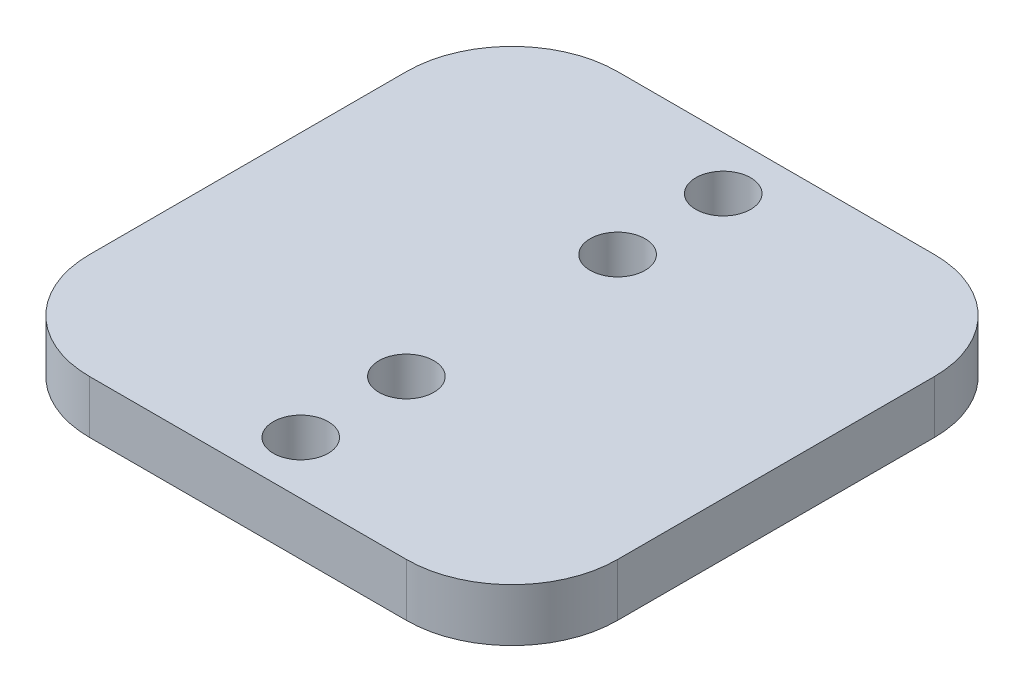
ISO-10303-21;
HEADER;
FILE_DESCRIPTION(('STEP AP214'),'2;1');
FILE_NAME('part.step','',(''),(''),'','','');
FILE_SCHEMA(('AUTOMOTIVE_DESIGN { 1 0 10303 214 1 1 1 1 }'));
ENDSEC;
DATA;
#1=APPLICATION_CONTEXT('core data for automotive mechanical design processes');
#2=APPLICATION_PROTOCOL_DEFINITION('international standard','automotive_design',2000,#1);
#3=PRODUCT_CONTEXT('',#1,'mechanical');
#4=PRODUCT('Part','Part','',(#3));
#5=PRODUCT_RELATED_PRODUCT_CATEGORY('part','',(#4));
#6=PRODUCT_DEFINITION_FORMATION('','',#4);
#7=PRODUCT_DEFINITION_CONTEXT('part definition',#1,'design');
#8=PRODUCT_DEFINITION('design','',#6,#7);
#9=PRODUCT_DEFINITION_SHAPE('','',#8);
#10=(LENGTH_UNIT() NAMED_UNIT(*) SI_UNIT(.MILLI.,.METRE.));
#11=(NAMED_UNIT(*) PLANE_ANGLE_UNIT() SI_UNIT($,.RADIAN.));
#12=(NAMED_UNIT(*) SI_UNIT($,.STERADIAN.) SOLID_ANGLE_UNIT());
#13=UNCERTAINTY_MEASURE_WITH_UNIT(LENGTH_MEASURE(1.E-05),#10,'distance_accuracy_value','');
#14=(GEOMETRIC_REPRESENTATION_CONTEXT(3) GLOBAL_UNCERTAINTY_ASSIGNED_CONTEXT((#13)) GLOBAL_UNIT_ASSIGNED_CONTEXT((#10,
#11,#12)) REPRESENTATION_CONTEXT('',''));
#15=CARTESIAN_POINT('',(0.,0.,0.));
#16=DIRECTION('',(0.,0.,1.));
#17=DIRECTION('',(1.,0.,0.));
#18=AXIS2_PLACEMENT_3D('',#15,#16,#17);
#19=CARTESIAN_POINT('',(0.,5.,0.));
#20=DIRECTION('',(1.,0.,0.));
#21=DIRECTION('',(0.,0.,-1.));
#22=AXIS2_PLACEMENT_3D('',#19,#20,#21);
#23=PLANE('',#22);
#24=DIRECTION('',(0.,0.,1.));
#25=VECTOR('',#24,1.);
#26=CARTESIAN_POINT('',(0.,0.,0.));
#27=LINE('',#26,#25);
#28=CARTESIAN_POINT('',(0.,0.,-40.));
#29=VERTEX_POINT('',#28);
#30=CARTESIAN_POINT('',(0.,0.,-10.));
#31=VERTEX_POINT('',#30);
#32=EDGE_CURVE('E148',#29,#31,#27,.T.);
#33=ORIENTED_EDGE('',*,*,#32,.T.);
#34=DIRECTION('',(0.,-1.,0.));
#35=VECTOR('',#34,1.);
#36=CARTESIAN_POINT('',(0.,5.,-10.));
#37=LINE('',#36,#35);
#38=CARTESIAN_POINT('',(0.,5.,-10.));
#39=VERTEX_POINT('',#38);
#40=EDGE_CURVE('E182',#31,#39,#37,.F.);
#41=ORIENTED_EDGE('',*,*,#40,.T.);
#42=DIRECTION('',(0.,0.,1.));
#43=VECTOR('',#42,1.);
#44=CARTESIAN_POINT('',(0.,5.,0.));
#45=LINE('',#44,#43);
#46=CARTESIAN_POINT('',(0.,5.,-40.));
#47=VERTEX_POINT('',#46);
#48=EDGE_CURVE('E146',#47,#39,#45,.T.);
#49=ORIENTED_EDGE('',*,*,#48,.F.);
#50=DIRECTION('',(0.,-1.,0.));
#51=VECTOR('',#50,1.);
#52=CARTESIAN_POINT('',(0.,5.,-40.));
#53=LINE('',#52,#51);
#54=EDGE_CURVE('E178',#47,#29,#53,.T.);
#55=ORIENTED_EDGE('',*,*,#54,.T.);
#56=EDGE_LOOP('',(#33,#41,#49,#55));
#57=FACE_BOUND('',#56,.T.);
#58=ADVANCED_FACE('F47',(#57),#23,.F.);
#59=CARTESIAN_POINT('',(0.,5.,0.));
#60=DIRECTION('',(0.,0.,-1.));
#61=DIRECTION('',(-1.,0.,0.));
#62=AXIS2_PLACEMENT_3D('',#59,#60,#61);
#63=PLANE('',#62);
#64=DIRECTION('',(1.,0.,0.));
#65=VECTOR('',#64,1.);
#66=CARTESIAN_POINT('',(0.,0.,0.));
#67=LINE('',#66,#65);
#68=CARTESIAN_POINT('',(10.,0.,0.));
#69=VERTEX_POINT('',#68);
#70=CARTESIAN_POINT('',(40.,0.,0.));
#71=VERTEX_POINT('',#70);
#72=EDGE_CURVE('E142',#69,#71,#67,.T.);
#73=ORIENTED_EDGE('',*,*,#72,.T.);
#74=DIRECTION('',(0.,-1.,0.));
#75=VECTOR('',#74,1.);
#76=CARTESIAN_POINT('',(40.,5.,0.));
#77=LINE('',#76,#75);
#78=CARTESIAN_POINT('',(40.,5.,0.));
#79=VERTEX_POINT('',#78);
#80=EDGE_CURVE('E118',#71,#79,#77,.F.);
#81=ORIENTED_EDGE('',*,*,#80,.T.);
#82=DIRECTION('',(1.,0.,0.));
#83=VECTOR('',#82,1.);
#84=CARTESIAN_POINT('',(0.,5.,0.));
#85=LINE('',#84,#83);
#86=CARTESIAN_POINT('',(10.,5.,0.));
#87=VERTEX_POINT('',#86);
#88=EDGE_CURVE('E201',#87,#79,#85,.T.);
#89=ORIENTED_EDGE('',*,*,#88,.F.);
#90=DIRECTION('',(0.,-1.,0.));
#91=VECTOR('',#90,1.);
#92=CARTESIAN_POINT('',(10.,5.,0.));
#93=LINE('',#92,#91);
#94=EDGE_CURVE('E124',#87,#69,#93,.T.);
#95=ORIENTED_EDGE('',*,*,#94,.T.);
#96=EDGE_LOOP('',(#73,#81,#89,#95));
#97=FACE_BOUND('',#96,.T.);
#98=ADVANCED_FACE('F258',(#97),#63,.F.);
#99=CARTESIAN_POINT('',(50.,5.,0.));
#100=DIRECTION('',(-1.,0.,0.));
#101=DIRECTION('',(0.,0.,1.));
#102=AXIS2_PLACEMENT_3D('',#99,#100,#101);
#103=PLANE('',#102);
#104=DIRECTION('',(0.,0.,-1.));
#105=VECTOR('',#104,1.);
#106=CARTESIAN_POINT('',(50.,5.,0.));
#107=LINE('',#106,#105);
#108=CARTESIAN_POINT('',(50.,5.,-10.));
#109=VERTEX_POINT('',#108);
#110=CARTESIAN_POINT('',(50.,5.,-40.));
#111=VERTEX_POINT('',#110);
#112=EDGE_CURVE('E133',#109,#111,#107,.T.);
#113=ORIENTED_EDGE('',*,*,#112,.F.);
#114=DIRECTION('',(0.,-1.,0.));
#115=VECTOR('',#114,1.);
#116=CARTESIAN_POINT('',(50.,5.,-10.));
#117=LINE('',#116,#115);
#118=CARTESIAN_POINT('',(50.,0.,-10.));
#119=VERTEX_POINT('',#118);
#120=EDGE_CURVE('E117',#109,#119,#117,.T.);
#121=ORIENTED_EDGE('',*,*,#120,.T.);
#122=DIRECTION('',(0.,0.,-1.));
#123=VECTOR('',#122,1.);
#124=CARTESIAN_POINT('',(50.,0.,0.));
#125=LINE('',#124,#123);
#126=CARTESIAN_POINT('',(50.,0.,-40.));
#127=VERTEX_POINT('',#126);
#128=EDGE_CURVE('E131',#119,#127,#125,.T.);
#129=ORIENTED_EDGE('',*,*,#128,.T.);
#130=DIRECTION('',(0.,-1.,0.));
#131=VECTOR('',#130,1.);
#132=CARTESIAN_POINT('',(50.,5.,-40.));
#133=LINE('',#132,#131);
#134=EDGE_CURVE('E136',#127,#111,#133,.F.);
#135=ORIENTED_EDGE('',*,*,#134,.T.);
#136=EDGE_LOOP('',(#113,#121,#129,#135));
#137=FACE_BOUND('',#136,.T.);
#138=ADVANCED_FACE('F130',(#137),#103,.F.);
#139=CARTESIAN_POINT('',(0.,5.,-50.));
#140=DIRECTION('',(0.,0.,1.));
#141=DIRECTION('',(1.,0.,0.));
#142=AXIS2_PLACEMENT_3D('',#139,#140,#141);
#143=PLANE('',#142);
#144=DIRECTION('',(-1.,0.,0.));
#145=VECTOR('',#144,1.);
#146=CARTESIAN_POINT('',(0.,0.,-50.));
#147=LINE('',#146,#145);
#148=CARTESIAN_POINT('',(40.,0.,-50.));
#149=VERTEX_POINT('',#148);
#150=CARTESIAN_POINT('',(10.,0.,-50.));
#151=VERTEX_POINT('',#150);
#152=EDGE_CURVE('E141',#149,#151,#147,.T.);
#153=ORIENTED_EDGE('',*,*,#152,.T.);
#154=DIRECTION('',(0.,-1.,0.));
#155=VECTOR('',#154,1.);
#156=CARTESIAN_POINT('',(10.,5.,-50.));
#157=LINE('',#156,#155);
#158=CARTESIAN_POINT('',(10.,5.,-50.));
#159=VERTEX_POINT('',#158);
#160=EDGE_CURVE('E11',#151,#159,#157,.F.);
#161=ORIENTED_EDGE('',*,*,#160,.T.);
#162=DIRECTION('',(-1.,0.,0.));
#163=VECTOR('',#162,1.);
#164=CARTESIAN_POINT('',(0.,5.,-50.));
#165=LINE('',#164,#163);
#166=CARTESIAN_POINT('',(40.,5.,-50.));
#167=VERTEX_POINT('',#166);
#168=EDGE_CURVE('E153',#167,#159,#165,.T.);
#169=ORIENTED_EDGE('',*,*,#168,.F.);
#170=DIRECTION('',(0.,-1.,0.));
#171=VECTOR('',#170,1.);
#172=CARTESIAN_POINT('',(40.,5.,-50.));
#173=LINE('',#172,#171);
#174=EDGE_CURVE('E56',#167,#149,#173,.T.);
#175=ORIENTED_EDGE('',*,*,#174,.T.);
#176=EDGE_LOOP('',(#153,#161,#169,#175));
#177=FACE_BOUND('',#176,.T.);
#178=ADVANCED_FACE('F187',(#177),#143,.F.);
#179=CARTESIAN_POINT('',(0.,5.,0.));
#180=DIRECTION('',(0.,-1.,0.));
#181=DIRECTION('',(0.,0.,-1.));
#182=AXIS2_PLACEMENT_3D('',#179,#180,#181);
#183=PLANE('',#182);
#184=CARTESIAN_POINT('',(25.,5.,-5.));
#185=DIRECTION('',(0.,1.,0.));
#186=DIRECTION('',(0.,0.,-1.));
#187=AXIS2_PLACEMENT_3D('',#184,#185,#186);
#188=CIRCLE('',#187,2.6);
#189=CARTESIAN_POINT('',(25.,5.,-7.6));
#190=VERTEX_POINT('',#189);
#191=EDGE_CURVE('E227',#190,#190,#188,.T.);
#192=ORIENTED_EDGE('',*,*,#191,.F.);
#193=EDGE_LOOP('',(#192));
#194=FACE_BOUND('',#193,.T.);
#195=CARTESIAN_POINT('',(25.,5.,-15.));
#196=DIRECTION('',(0.,1.,0.));
#197=DIRECTION('',(0.,0.,-1.));
#198=AXIS2_PLACEMENT_3D('',#195,#196,#197);
#199=CIRCLE('',#198,2.6);
#200=CARTESIAN_POINT('',(25.,5.,-17.6));
#201=VERTEX_POINT('',#200);
#202=EDGE_CURVE('E235',#201,#201,#199,.T.);
#203=ORIENTED_EDGE('',*,*,#202,.F.);
#204=EDGE_LOOP('',(#203));
#205=FACE_BOUND('',#204,.T.);
#206=CARTESIAN_POINT('',(25.,5.,-45.));
#207=DIRECTION('',(0.,1.,0.));
#208=DIRECTION('',(0.,0.,1.));
#209=AXIS2_PLACEMENT_3D('',#206,#207,#208);
#210=CIRCLE('',#209,2.6);
#211=CARTESIAN_POINT('',(25.,5.,-42.4));
#212=VERTEX_POINT('',#211);
#213=EDGE_CURVE('E221',#212,#212,#210,.T.);
#214=ORIENTED_EDGE('',*,*,#213,.F.);
#215=EDGE_LOOP('',(#214));
#216=FACE_BOUND('',#215,.T.);
#217=CARTESIAN_POINT('',(25.,5.,-35.));
#218=DIRECTION('',(0.,1.,0.));
#219=DIRECTION('',(0.,0.,1.));
#220=AXIS2_PLACEMENT_3D('',#217,#218,#219);
#221=CIRCLE('',#220,2.6);
#222=CARTESIAN_POINT('',(25.,5.,-32.4));
#223=VERTEX_POINT('',#222);
#224=EDGE_CURVE('E207',#223,#223,#221,.T.);
#225=ORIENTED_EDGE('',*,*,#224,.F.);
#226=EDGE_LOOP('',(#225));
#227=FACE_BOUND('',#226,.T.);
#228=ORIENTED_EDGE('',*,*,#88,.T.);
#229=CARTESIAN_POINT('',(40.,5.,-10.));
#230=DIRECTION('',(0.,-1.,0.));
#231=DIRECTION('',(0.,0.,-1.));
#232=AXIS2_PLACEMENT_3D('',#229,#230,#231);
#233=CIRCLE('',#232,10.);
#234=EDGE_CURVE('E175',#79,#109,#233,.F.);
#235=ORIENTED_EDGE('',*,*,#234,.T.);
#236=ORIENTED_EDGE('',*,*,#112,.T.);
#237=CARTESIAN_POINT('',(40.,5.,-40.));
#238=DIRECTION('',(0.,-1.,0.));
#239=DIRECTION('',(0.,0.,-1.));
#240=AXIS2_PLACEMENT_3D('',#237,#238,#239);
#241=CIRCLE('',#240,10.);
#242=EDGE_CURVE('E68',#111,#167,#241,.F.);
#243=ORIENTED_EDGE('',*,*,#242,.T.);
#244=ORIENTED_EDGE('',*,*,#168,.T.);
#245=CARTESIAN_POINT('',(10.,5.,-40.));
#246=DIRECTION('',(0.,-1.,0.));
#247=DIRECTION('',(0.,0.,-1.));
#248=AXIS2_PLACEMENT_3D('',#245,#246,#247);
#249=CIRCLE('',#248,10.);
#250=EDGE_CURVE('E169',#159,#47,#249,.F.);
#251=ORIENTED_EDGE('',*,*,#250,.T.);
#252=ORIENTED_EDGE('',*,*,#48,.T.);
#253=CARTESIAN_POINT('',(10.,5.,-10.));
#254=DIRECTION('',(0.,-1.,0.));
#255=DIRECTION('',(0.,0.,-1.));
#256=AXIS2_PLACEMENT_3D('',#253,#254,#255);
#257=CIRCLE('',#256,10.);
#258=EDGE_CURVE('E172',#39,#87,#257,.F.);
#259=ORIENTED_EDGE('',*,*,#258,.T.);
#260=EDGE_LOOP('',(#228,#235,#236,#243,#244,#251,#252,#259));
#261=FACE_BOUND('',#260,.T.);
#262=ADVANCED_FACE('F249',(#194,#205,#216,#227,#261),#183,.F.);
#263=CARTESIAN_POINT('',(0.,0.,0.));
#264=DIRECTION('',(0.,-1.,0.));
#265=DIRECTION('',(0.,0.,-1.));
#266=AXIS2_PLACEMENT_3D('',#263,#264,#265);
#267=PLANE('',#266);
#268=CARTESIAN_POINT('',(25.,0.,-5.));
#269=DIRECTION('',(0.,1.,0.));
#270=DIRECTION('',(0.,0.,-1.));
#271=AXIS2_PLACEMENT_3D('',#268,#269,#270);
#272=CIRCLE('',#271,2.6);
#273=CARTESIAN_POINT('',(25.,0.,-7.6));
#274=VERTEX_POINT('',#273);
#275=EDGE_CURVE('E223',#274,#274,#272,.T.);
#276=ORIENTED_EDGE('',*,*,#275,.T.);
#277=EDGE_LOOP('',(#276));
#278=FACE_BOUND('',#277,.T.);
#279=CARTESIAN_POINT('',(25.,0.,-15.));
#280=DIRECTION('',(0.,1.,0.));
#281=DIRECTION('',(0.,0.,-1.));
#282=AXIS2_PLACEMENT_3D('',#279,#280,#281);
#283=CIRCLE('',#282,2.6);
#284=CARTESIAN_POINT('',(25.,0.,-17.6));
#285=VERTEX_POINT('',#284);
#286=EDGE_CURVE('E231',#285,#285,#283,.T.);
#287=ORIENTED_EDGE('',*,*,#286,.T.);
#288=EDGE_LOOP('',(#287));
#289=FACE_BOUND('',#288,.T.);
#290=CARTESIAN_POINT('',(25.,0.,-45.));
#291=DIRECTION('',(0.,1.,0.));
#292=DIRECTION('',(0.,0.,1.));
#293=AXIS2_PLACEMENT_3D('',#290,#291,#292);
#294=CIRCLE('',#293,2.6);
#295=CARTESIAN_POINT('',(25.,0.,-42.4));
#296=VERTEX_POINT('',#295);
#297=EDGE_CURVE('E239',#296,#296,#294,.T.);
#298=ORIENTED_EDGE('',*,*,#297,.T.);
#299=EDGE_LOOP('',(#298));
#300=FACE_BOUND('',#299,.T.);
#301=CARTESIAN_POINT('',(25.,0.,-35.));
#302=DIRECTION('',(0.,1.,0.));
#303=DIRECTION('',(0.,0.,1.));
#304=AXIS2_PLACEMENT_3D('',#301,#302,#303);
#305=CIRCLE('',#304,2.6);
#306=CARTESIAN_POINT('',(25.,0.,-32.4));
#307=VERTEX_POINT('',#306);
#308=EDGE_CURVE('E214',#307,#307,#305,.T.);
#309=ORIENTED_EDGE('',*,*,#308,.T.);
#310=EDGE_LOOP('',(#309));
#311=FACE_BOUND('',#310,.T.);
#312=ORIENTED_EDGE('',*,*,#128,.F.);
#313=CARTESIAN_POINT('',(40.,0.,-10.));
#314=DIRECTION('',(0.,-1.,0.));
#315=DIRECTION('',(0.,0.,-1.));
#316=AXIS2_PLACEMENT_3D('',#313,#314,#315);
#317=CIRCLE('',#316,10.);
#318=EDGE_CURVE('E113',#119,#71,#317,.T.);
#319=ORIENTED_EDGE('',*,*,#318,.T.);
#320=ORIENTED_EDGE('',*,*,#72,.F.);
#321=CARTESIAN_POINT('',(10.,0.,-10.));
#322=DIRECTION('',(0.,-1.,0.));
#323=DIRECTION('',(0.,0.,-1.));
#324=AXIS2_PLACEMENT_3D('',#321,#322,#323);
#325=CIRCLE('',#324,10.);
#326=EDGE_CURVE('E125',#69,#31,#325,.T.);
#327=ORIENTED_EDGE('',*,*,#326,.T.);
#328=ORIENTED_EDGE('',*,*,#32,.F.);
#329=CARTESIAN_POINT('',(10.,0.,-40.));
#330=DIRECTION('',(0.,-1.,0.));
#331=DIRECTION('',(0.,0.,-1.));
#332=AXIS2_PLACEMENT_3D('',#329,#330,#331);
#333=CIRCLE('',#332,10.);
#334=EDGE_CURVE('E157',#29,#151,#333,.T.);
#335=ORIENTED_EDGE('',*,*,#334,.T.);
#336=ORIENTED_EDGE('',*,*,#152,.F.);
#337=CARTESIAN_POINT('',(40.,0.,-40.));
#338=DIRECTION('',(0.,-1.,0.));
#339=DIRECTION('',(0.,0.,-1.));
#340=AXIS2_PLACEMENT_3D('',#337,#338,#339);
#341=CIRCLE('',#340,10.);
#342=EDGE_CURVE('E135',#149,#127,#341,.T.);
#343=ORIENTED_EDGE('',*,*,#342,.T.);
#344=EDGE_LOOP('',(#312,#319,#320,#327,#328,#335,#336,#343));
#345=FACE_BOUND('',#344,.T.);
#346=ADVANCED_FACE('F138',(#278,#289,#300,#311,#345),#267,.T.);
#347=CARTESIAN_POINT('',(25.,0.,-35.));
#348=DIRECTION('',(0.,1.,0.));
#349=DIRECTION('',(0.,0.,1.));
#350=AXIS2_PLACEMENT_3D('',#347,#348,#349);
#351=CYLINDRICAL_SURFACE('',#350,2.6);
#352=ORIENTED_EDGE('',*,*,#308,.F.);
#353=EDGE_LOOP('',(#352));
#354=FACE_BOUND('',#353,.T.);
#355=ORIENTED_EDGE('',*,*,#224,.T.);
#356=EDGE_LOOP('',(#355));
#357=FACE_BOUND('',#356,.T.);
#358=ADVANCED_FACE('F282',(#354,#357),#351,.F.);
#359=CARTESIAN_POINT('',(25.,0.,-45.));
#360=DIRECTION('',(0.,1.,0.));
#361=DIRECTION('',(0.,0.,1.));
#362=AXIS2_PLACEMENT_3D('',#359,#360,#361);
#363=CYLINDRICAL_SURFACE('',#362,2.6);
#364=ORIENTED_EDGE('',*,*,#297,.F.);
#365=EDGE_LOOP('',(#364));
#366=FACE_BOUND('',#365,.T.);
#367=ORIENTED_EDGE('',*,*,#213,.T.);
#368=EDGE_LOOP('',(#367));
#369=FACE_BOUND('',#368,.T.);
#370=ADVANCED_FACE('F247',(#366,#369),#363,.F.);
#371=CARTESIAN_POINT('',(25.,0.,-15.));
#372=DIRECTION('',(0.,1.,0.));
#373=DIRECTION('',(0.,0.,1.));
#374=AXIS2_PLACEMENT_3D('',#371,#372,#373);
#375=CYLINDRICAL_SURFACE('',#374,2.6);
#376=ORIENTED_EDGE('',*,*,#286,.F.);
#377=EDGE_LOOP('',(#376));
#378=FACE_BOUND('',#377,.T.);
#379=ORIENTED_EDGE('',*,*,#202,.T.);
#380=EDGE_LOOP('',(#379));
#381=FACE_BOUND('',#380,.T.);
#382=ADVANCED_FACE('F289',(#378,#381),#375,.F.);
#383=CARTESIAN_POINT('',(25.,0.,-5.));
#384=DIRECTION('',(0.,1.,0.));
#385=DIRECTION('',(0.,0.,1.));
#386=AXIS2_PLACEMENT_3D('',#383,#384,#385);
#387=CYLINDRICAL_SURFACE('',#386,2.6);
#388=ORIENTED_EDGE('',*,*,#275,.F.);
#389=EDGE_LOOP('',(#388));
#390=FACE_BOUND('',#389,.T.);
#391=ORIENTED_EDGE('',*,*,#191,.T.);
#392=EDGE_LOOP('',(#391));
#393=FACE_BOUND('',#392,.T.);
#394=ADVANCED_FACE('F267',(#390,#393),#387,.F.);
#395=CARTESIAN_POINT('',(40.,5.,-10.));
#396=DIRECTION('',(0.,-1.,0.));
#397=DIRECTION('',(0.,0.,-1.));
#398=AXIS2_PLACEMENT_3D('',#395,#396,#397);
#399=CYLINDRICAL_SURFACE('',#398,10.);
#400=ORIENTED_EDGE('',*,*,#234,.F.);
#401=ORIENTED_EDGE('',*,*,#80,.F.);
#402=ORIENTED_EDGE('',*,*,#318,.F.);
#403=ORIENTED_EDGE('',*,*,#120,.F.);
#404=EDGE_LOOP('',(#400,#401,#402,#403));
#405=FACE_BOUND('',#404,.T.);
#406=ADVANCED_FACE('F116',(#405),#399,.T.);
#407=CARTESIAN_POINT('',(10.,5.,-10.));
#408=DIRECTION('',(0.,-1.,0.));
#409=DIRECTION('',(0.,0.,-1.));
#410=AXIS2_PLACEMENT_3D('',#407,#408,#409);
#411=CYLINDRICAL_SURFACE('',#410,10.);
#412=ORIENTED_EDGE('',*,*,#258,.F.);
#413=ORIENTED_EDGE('',*,*,#40,.F.);
#414=ORIENTED_EDGE('',*,*,#326,.F.);
#415=ORIENTED_EDGE('',*,*,#94,.F.);
#416=EDGE_LOOP('',(#412,#413,#414,#415));
#417=FACE_BOUND('',#416,.T.);
#418=ADVANCED_FACE('F260',(#417),#411,.T.);
#419=CARTESIAN_POINT('',(10.,5.,-40.));
#420=DIRECTION('',(0.,-1.,0.));
#421=DIRECTION('',(0.,0.,-1.));
#422=AXIS2_PLACEMENT_3D('',#419,#420,#421);
#423=CYLINDRICAL_SURFACE('',#422,10.);
#424=ORIENTED_EDGE('',*,*,#250,.F.);
#425=ORIENTED_EDGE('',*,*,#160,.F.);
#426=ORIENTED_EDGE('',*,*,#334,.F.);
#427=ORIENTED_EDGE('',*,*,#54,.F.);
#428=EDGE_LOOP('',(#424,#425,#426,#427));
#429=FACE_BOUND('',#428,.T.);
#430=ADVANCED_FACE('F194',(#429),#423,.T.);
#431=CARTESIAN_POINT('',(40.,5.,-40.));
#432=DIRECTION('',(0.,-1.,0.));
#433=DIRECTION('',(0.,0.,-1.));
#434=AXIS2_PLACEMENT_3D('',#431,#432,#433);
#435=CYLINDRICAL_SURFACE('',#434,10.);
#436=ORIENTED_EDGE('',*,*,#242,.F.);
#437=ORIENTED_EDGE('',*,*,#134,.F.);
#438=ORIENTED_EDGE('',*,*,#342,.F.);
#439=ORIENTED_EDGE('',*,*,#174,.F.);
#440=EDGE_LOOP('',(#436,#437,#438,#439));
#441=FACE_BOUND('',#440,.T.);
#442=ADVANCED_FACE('F49',(#441),#435,.T.);
#443=CLOSED_SHELL('',(#58,#98,#138,#178,#262,#346,#358,#370,#382,#394,#406,#418,#430,#442));
#444=MANIFOLD_SOLID_BREP('B2',#443);
#445=ADVANCED_BREP_SHAPE_REPRESENTATION('',(#18,#444),#14);
#446=SHAPE_DEFINITION_REPRESENTATION(#9,#445);
ENDSEC;
END-ISO-10303-21;
